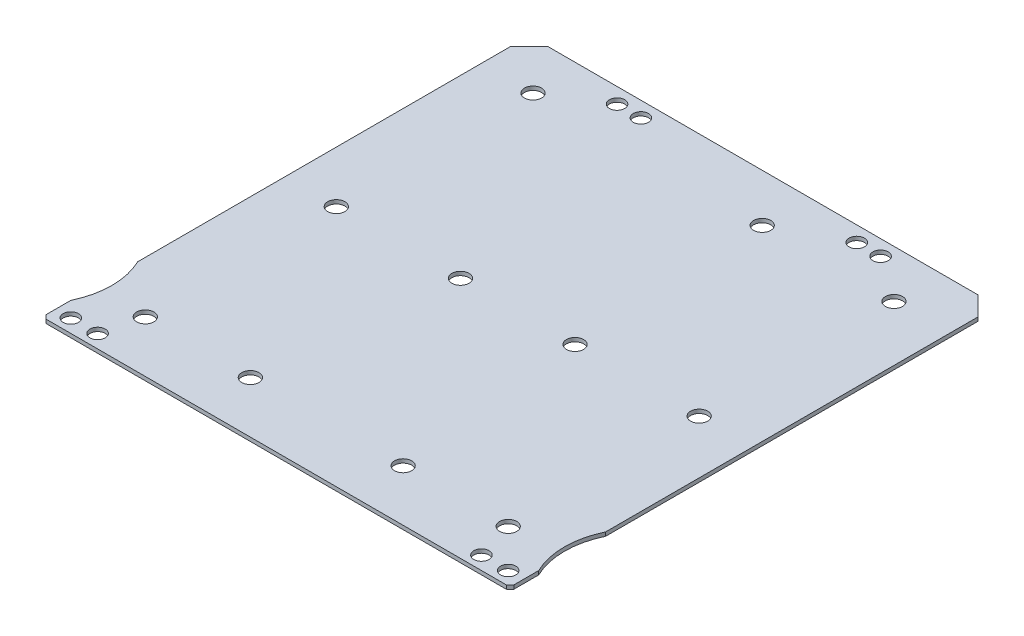
ISO-10303-21;
HEADER;
FILE_DESCRIPTION(('STEP AP214'),'2;1');
FILE_NAME('part.step','',(''),(''),'','','');
FILE_SCHEMA(('AUTOMOTIVE_DESIGN { 1 0 10303 214 1 1 1 1 }'));
ENDSEC;
DATA;
#1=APPLICATION_CONTEXT('core data for automotive mechanical design processes');
#2=APPLICATION_PROTOCOL_DEFINITION('international standard','automotive_design',2000,#1);
#3=PRODUCT_CONTEXT('',#1,'mechanical');
#4=PRODUCT('Part','Part','',(#3));
#5=PRODUCT_RELATED_PRODUCT_CATEGORY('part','',(#4));
#6=PRODUCT_DEFINITION_FORMATION('','',#4);
#7=PRODUCT_DEFINITION_CONTEXT('part definition',#1,'design');
#8=PRODUCT_DEFINITION('design','',#6,#7);
#9=PRODUCT_DEFINITION_SHAPE('','',#8);
#10=(LENGTH_UNIT() NAMED_UNIT(*) SI_UNIT(.MILLI.,.METRE.));
#11=(NAMED_UNIT(*) PLANE_ANGLE_UNIT() SI_UNIT($,.RADIAN.));
#12=(NAMED_UNIT(*) SI_UNIT($,.STERADIAN.) SOLID_ANGLE_UNIT());
#13=UNCERTAINTY_MEASURE_WITH_UNIT(LENGTH_MEASURE(1.E-05),#10,'distance_accuracy_value','');
#14=(GEOMETRIC_REPRESENTATION_CONTEXT(3) GLOBAL_UNCERTAINTY_ASSIGNED_CONTEXT((#13)) GLOBAL_UNIT_ASSIGNED_CONTEXT((#10,
#11,#12)) REPRESENTATION_CONTEXT('',''));
#15=CARTESIAN_POINT('',(0.,0.,0.));
#16=DIRECTION('',(0.,0.,1.));
#17=DIRECTION('',(1.,0.,0.));
#18=AXIS2_PLACEMENT_3D('',#15,#16,#17);
#19=CARTESIAN_POINT('',(-36.2812500000003,2.,-32.5));
#20=DIRECTION('',(0.,-1.,0.));
#21=DIRECTION('',(0.,0.,-1.));
#22=AXIS2_PLACEMENT_3D('',#19,#20,#21);
#23=PLANE('',#22);
#24=DIRECTION('',(0.,0.,-1.));
#25=VECTOR('',#24,1.);
#26=CARTESIAN_POINT('',(245.,2.,-50.));
#27=LINE('',#26,#25);
#28=CARTESIAN_POINT('',(245.,2.,-50.));
#29=VERTEX_POINT('',#28);
#30=CARTESIAN_POINT('',(245.,2.,-245.));
#31=VERTEX_POINT('',#30);
#32=EDGE_CURVE('E149',#29,#31,#27,.T.);
#33=ORIENTED_EDGE('',*,*,#32,.T.);
#34=DIRECTION('',(0.707106781186548,0.,0.707106781186548));
#35=VECTOR('',#34,1.);
#36=CARTESIAN_POINT('',(235.,2.,-255.));
#37=LINE('',#36,#35);
#38=CARTESIAN_POINT('',(235.,2.,-255.));
#39=VERTEX_POINT('',#38);
#40=EDGE_CURVE('E41',#31,#39,#37,.F.);
#41=ORIENTED_EDGE('',*,*,#40,.T.);
#42=DIRECTION('',(-1.,0.,0.));
#43=VECTOR('',#42,1.);
#44=CARTESIAN_POINT('',(0.,2.,-255.));
#45=LINE('',#44,#43);
#46=CARTESIAN_POINT('',(10.,2.,-255.));
#47=VERTEX_POINT('',#46);
#48=EDGE_CURVE('E151',#39,#47,#45,.T.);
#49=ORIENTED_EDGE('',*,*,#48,.T.);
#50=DIRECTION('',(0.707106781186549,0.,-0.707106781186546));
#51=VECTOR('',#50,1.);
#52=CARTESIAN_POINT('',(0.,2.,-245.));
#53=LINE('',#52,#51);
#54=CARTESIAN_POINT('',(0.,2.,-245.));
#55=VERTEX_POINT('',#54);
#56=EDGE_CURVE('E48',#47,#55,#53,.F.);
#57=ORIENTED_EDGE('',*,*,#56,.T.);
#58=DIRECTION('',(0.,0.,1.));
#59=VECTOR('',#58,1.);
#60=CARTESIAN_POINT('',(0.,2.,-50.));
#61=LINE('',#60,#59);
#62=CARTESIAN_POINT('',(0.,2.,-50.));
#63=VERTEX_POINT('',#62);
#64=EDGE_CURVE('E156',#55,#63,#61,.T.);
#65=ORIENTED_EDGE('',*,*,#64,.T.);
#66=CARTESIAN_POINT('',(-36.2812500000003,2.,-32.5));
#67=DIRECTION('',(0.,-1.,0.));
#68=DIRECTION('',(0.,0.,-1.));
#69=AXIS2_PLACEMENT_3D('',#66,#67,#68);
#70=CIRCLE('',#69,40.2812500000003);
#71=CARTESIAN_POINT('',(0.,2.,-15.));
#72=VERTEX_POINT('',#71);
#73=EDGE_CURVE('E158',#63,#72,#70,.T.);
#74=ORIENTED_EDGE('',*,*,#73,.T.);
#75=DIRECTION('',(0.,0.,1.));
#76=VECTOR('',#75,1.);
#77=CARTESIAN_POINT('',(0.,2.,0.));
#78=LINE('',#77,#76);
#79=CARTESIAN_POINT('',(0.,2.,-2.00000000000006));
#80=VERTEX_POINT('',#79);
#81=EDGE_CURVE('E180',#72,#80,#78,.T.);
#82=ORIENTED_EDGE('',*,*,#81,.T.);
#83=DIRECTION('',(-0.707106781186538,0.,-0.707106781186557));
#84=VECTOR('',#83,1.);
#85=CARTESIAN_POINT('',(2.,2.,0.));
#86=LINE('',#85,#84);
#87=CARTESIAN_POINT('',(2.,2.,0.));
#88=VERTEX_POINT('',#87);
#89=EDGE_CURVE('E198',#80,#88,#86,.F.);
#90=ORIENTED_EDGE('',*,*,#89,.T.);
#91=DIRECTION('',(1.,0.,0.));
#92=VECTOR('',#91,1.);
#93=CARTESIAN_POINT('',(0.,2.,0.));
#94=LINE('',#93,#92);
#95=CARTESIAN_POINT('',(243.,2.,0.));
#96=VERTEX_POINT('',#95);
#97=EDGE_CURVE('E135',#88,#96,#94,.T.);
#98=ORIENTED_EDGE('',*,*,#97,.T.);
#99=DIRECTION('',(-0.707106781186557,0.,0.707106781186538));
#100=VECTOR('',#99,1.);
#101=CARTESIAN_POINT('',(245.,2.,-2.));
#102=LINE('',#101,#100);
#103=CARTESIAN_POINT('',(245.,2.,-2.));
#104=VERTEX_POINT('',#103);
#105=EDGE_CURVE('E131',#96,#104,#102,.F.);
#106=ORIENTED_EDGE('',*,*,#105,.T.);
#107=DIRECTION('',(0.,0.,-1.));
#108=VECTOR('',#107,1.);
#109=CARTESIAN_POINT('',(245.,2.,0.));
#110=LINE('',#109,#108);
#111=CARTESIAN_POINT('',(245.,2.,-15.));
#112=VERTEX_POINT('',#111);
#113=EDGE_CURVE('E123',#104,#112,#110,.T.);
#114=ORIENTED_EDGE('',*,*,#113,.T.);
#115=CARTESIAN_POINT('',(281.28125,2.,-32.5));
#116=DIRECTION('',(0.,-1.,0.));
#117=DIRECTION('',(0.,0.,1.));
#118=AXIS2_PLACEMENT_3D('',#115,#116,#117);
#119=CIRCLE('',#118,40.2812500000003);
#120=EDGE_CURVE('E127',#112,#29,#119,.T.);
#121=ORIENTED_EDGE('',*,*,#120,.T.);
#122=EDGE_LOOP('',(#33,#41,#49,#57,#65,#74,#82,#90,#98,#106,#114,#121));
#123=FACE_BOUND('',#122,.T.);
#124=CARTESIAN_POINT('',(8.,2.,-7.));
#125=DIRECTION('',(0.,1.,0.));
#126=DIRECTION('',(0.,0.,1.));
#127=AXIS2_PLACEMENT_3D('',#124,#125,#126);
#128=CIRCLE('',#127,4.);
#129=CARTESIAN_POINT('',(8.,2.,-3.));
#130=VERTEX_POINT('',#129);
#131=EDGE_CURVE('E165',#130,#130,#128,.T.);
#132=ORIENTED_EDGE('',*,*,#131,.F.);
#133=EDGE_LOOP('',(#132));
#134=FACE_BOUND('',#133,.T.);
#135=CARTESIAN_POINT('',(22.,2.,-7.));
#136=DIRECTION('',(0.,1.,0.));
#137=DIRECTION('',(0.,0.,1.));
#138=AXIS2_PLACEMENT_3D('',#135,#136,#137);
#139=CIRCLE('',#138,4.00000000000001);
#140=CARTESIAN_POINT('',(22.,2.,-2.99999999999999));
#141=VERTEX_POINT('',#140);
#142=EDGE_CURVE('E283',#141,#141,#139,.T.);
#143=ORIENTED_EDGE('',*,*,#142,.F.);
#144=EDGE_LOOP('',(#143));
#145=FACE_BOUND('',#144,.T.);
#146=CARTESIAN_POINT('',(237.,2.,-7.));
#147=DIRECTION('',(0.,1.,0.));
#148=DIRECTION('',(0.,0.,1.));
#149=AXIS2_PLACEMENT_3D('',#146,#147,#148);
#150=CIRCLE('',#149,3.99999999999999);
#151=CARTESIAN_POINT('',(237.,2.,-3.00000000000001));
#152=VERTEX_POINT('',#151);
#153=EDGE_CURVE('E289',#152,#152,#150,.T.);
#154=ORIENTED_EDGE('',*,*,#153,.F.);
#155=EDGE_LOOP('',(#154));
#156=FACE_BOUND('',#155,.T.);
#157=CARTESIAN_POINT('',(223.,2.,-7.));
#158=DIRECTION('',(0.,1.,0.));
#159=DIRECTION('',(0.,0.,1.));
#160=AXIS2_PLACEMENT_3D('',#157,#158,#159);
#161=CIRCLE('',#160,3.99999999999999);
#162=CARTESIAN_POINT('',(223.,2.,-3.00000000000001));
#163=VERTEX_POINT('',#162);
#164=EDGE_CURVE('E295',#163,#163,#161,.T.);
#165=ORIENTED_EDGE('',*,*,#164,.F.);
#166=EDGE_LOOP('',(#165));
#167=FACE_BOUND('',#166,.T.);
#168=CARTESIAN_POINT('',(27.,2.,-27.));
#169=DIRECTION('',(0.,1.,0.));
#170=DIRECTION('',(0.,0.,1.));
#171=AXIS2_PLACEMENT_3D('',#168,#169,#170);
#172=CIRCLE('',#171,4.5);
#173=CARTESIAN_POINT('',(27.,2.,-22.5));
#174=VERTEX_POINT('',#173);
#175=EDGE_CURVE('E301',#174,#174,#172,.T.);
#176=ORIENTED_EDGE('',*,*,#175,.F.);
#177=EDGE_LOOP('',(#176));
#178=FACE_BOUND('',#177,.T.);
#179=CARTESIAN_POINT('',(82.,2.,-27.));
#180=DIRECTION('',(0.,1.,0.));
#181=DIRECTION('',(0.,0.,1.));
#182=AXIS2_PLACEMENT_3D('',#179,#180,#181);
#183=CIRCLE('',#182,4.5);
#184=CARTESIAN_POINT('',(82.,2.,-22.5));
#185=VERTEX_POINT('',#184);
#186=EDGE_CURVE('E307',#185,#185,#183,.T.);
#187=ORIENTED_EDGE('',*,*,#186,.F.);
#188=EDGE_LOOP('',(#187));
#189=FACE_BOUND('',#188,.T.);
#190=CARTESIAN_POINT('',(162.,2.,-27.));
#191=DIRECTION('',(0.,1.,0.));
#192=DIRECTION('',(0.,0.,1.));
#193=AXIS2_PLACEMENT_3D('',#190,#191,#192);
#194=CIRCLE('',#193,4.49999999999999);
#195=CARTESIAN_POINT('',(162.,2.,-22.5));
#196=VERTEX_POINT('',#195);
#197=EDGE_CURVE('E313',#196,#196,#194,.T.);
#198=ORIENTED_EDGE('',*,*,#197,.F.);
#199=EDGE_LOOP('',(#198));
#200=FACE_BOUND('',#199,.T.);
#201=CARTESIAN_POINT('',(217.,2.,-27.));
#202=DIRECTION('',(0.,1.,0.));
#203=DIRECTION('',(0.,0.,1.));
#204=AXIS2_PLACEMENT_3D('',#201,#202,#203);
#205=CIRCLE('',#204,4.49999999999999);
#206=CARTESIAN_POINT('',(217.,2.,-22.5));
#207=VERTEX_POINT('',#206);
#208=EDGE_CURVE('E319',#207,#207,#205,.T.);
#209=ORIENTED_EDGE('',*,*,#208,.F.);
#210=EDGE_LOOP('',(#209));
#211=FACE_BOUND('',#210,.T.);
#212=CARTESIAN_POINT('',(27.,2.,-127.));
#213=DIRECTION('',(0.,1.,0.));
#214=DIRECTION('',(0.,0.,1.));
#215=AXIS2_PLACEMENT_3D('',#212,#213,#214);
#216=CIRCLE('',#215,4.5);
#217=CARTESIAN_POINT('',(27.,2.,-122.5));
#218=VERTEX_POINT('',#217);
#219=EDGE_CURVE('E325',#218,#218,#216,.T.);
#220=ORIENTED_EDGE('',*,*,#219,.F.);
#221=EDGE_LOOP('',(#220));
#222=FACE_BOUND('',#221,.T.);
#223=CARTESIAN_POINT('',(92.,2.,-127.));
#224=DIRECTION('',(0.,1.,0.));
#225=DIRECTION('',(0.,0.,1.));
#226=AXIS2_PLACEMENT_3D('',#223,#224,#225);
#227=CIRCLE('',#226,4.50000000000001);
#228=CARTESIAN_POINT('',(92.,2.,-122.5));
#229=VERTEX_POINT('',#228);
#230=EDGE_CURVE('E331',#229,#229,#227,.T.);
#231=ORIENTED_EDGE('',*,*,#230,.F.);
#232=EDGE_LOOP('',(#231));
#233=FACE_BOUND('',#232,.T.);
#234=CARTESIAN_POINT('',(152.,2.,-127.));
#235=DIRECTION('',(0.,1.,0.));
#236=DIRECTION('',(0.,0.,1.));
#237=AXIS2_PLACEMENT_3D('',#234,#235,#236);
#238=CIRCLE('',#237,4.49999999999999);
#239=CARTESIAN_POINT('',(152.,2.,-122.5));
#240=VERTEX_POINT('',#239);
#241=EDGE_CURVE('E337',#240,#240,#238,.T.);
#242=ORIENTED_EDGE('',*,*,#241,.F.);
#243=EDGE_LOOP('',(#242));
#244=FACE_BOUND('',#243,.T.);
#245=CARTESIAN_POINT('',(217.,2.,-127.));
#246=DIRECTION('',(0.,1.,0.));
#247=DIRECTION('',(0.,0.,1.));
#248=AXIS2_PLACEMENT_3D('',#245,#246,#247);
#249=CIRCLE('',#248,4.50000000000002);
#250=CARTESIAN_POINT('',(217.,2.,-122.5));
#251=VERTEX_POINT('',#250);
#252=EDGE_CURVE('E343',#251,#251,#249,.T.);
#253=ORIENTED_EDGE('',*,*,#252,.F.);
#254=EDGE_LOOP('',(#253));
#255=FACE_BOUND('',#254,.T.);
#256=CARTESIAN_POINT('',(27.,2.,-230.));
#257=DIRECTION('',(0.,1.,0.));
#258=DIRECTION('',(0.,0.,1.));
#259=AXIS2_PLACEMENT_3D('',#256,#257,#258);
#260=CIRCLE('',#259,4.5);
#261=CARTESIAN_POINT('',(27.,2.,-225.5));
#262=VERTEX_POINT('',#261);
#263=EDGE_CURVE('E349',#262,#262,#260,.T.);
#264=ORIENTED_EDGE('',*,*,#263,.F.);
#265=EDGE_LOOP('',(#264));
#266=FACE_BOUND('',#265,.T.);
#267=CARTESIAN_POINT('',(147.,2.,-230.));
#268=DIRECTION('',(0.,1.,0.));
#269=DIRECTION('',(0.,0.,1.));
#270=AXIS2_PLACEMENT_3D('',#267,#268,#269);
#271=CIRCLE('',#270,4.49999999999999);
#272=CARTESIAN_POINT('',(147.,2.,-225.5));
#273=VERTEX_POINT('',#272);
#274=EDGE_CURVE('E355',#273,#273,#271,.T.);
#275=ORIENTED_EDGE('',*,*,#274,.F.);
#276=EDGE_LOOP('',(#275));
#277=FACE_BOUND('',#276,.T.);
#278=CARTESIAN_POINT('',(216.,2.,-230.));
#279=DIRECTION('',(0.,1.,0.));
#280=DIRECTION('',(0.,0.,1.));
#281=AXIS2_PLACEMENT_3D('',#278,#279,#280);
#282=CIRCLE('',#281,4.49999999999999);
#283=CARTESIAN_POINT('',(216.,2.,-225.5));
#284=VERTEX_POINT('',#283);
#285=EDGE_CURVE('E361',#284,#284,#282,.T.);
#286=ORIENTED_EDGE('',*,*,#285,.F.);
#287=EDGE_LOOP('',(#286));
#288=FACE_BOUND('',#287,.T.);
#289=CARTESIAN_POINT('',(54.,2.,-247.));
#290=DIRECTION('',(0.,1.,0.));
#291=DIRECTION('',(0.,0.,1.));
#292=AXIS2_PLACEMENT_3D('',#289,#290,#291);
#293=CIRCLE('',#292,4.);
#294=CARTESIAN_POINT('',(54.,2.,-243.));
#295=VERTEX_POINT('',#294);
#296=EDGE_CURVE('E367',#295,#295,#293,.T.);
#297=ORIENTED_EDGE('',*,*,#296,.F.);
#298=EDGE_LOOP('',(#297));
#299=FACE_BOUND('',#298,.T.);
#300=CARTESIAN_POINT('',(66.5,2.,-247.));
#301=DIRECTION('',(0.,1.,0.));
#302=DIRECTION('',(0.,0.,1.));
#303=AXIS2_PLACEMENT_3D('',#300,#301,#302);
#304=CIRCLE('',#303,4.00000000000001);
#305=CARTESIAN_POINT('',(66.5,2.,-243.));
#306=VERTEX_POINT('',#305);
#307=EDGE_CURVE('E373',#306,#306,#304,.T.);
#308=ORIENTED_EDGE('',*,*,#307,.F.);
#309=EDGE_LOOP('',(#308));
#310=FACE_BOUND('',#309,.T.);
#311=CARTESIAN_POINT('',(179.5,2.,-247.));
#312=DIRECTION('',(0.,1.,0.));
#313=DIRECTION('',(0.,0.,1.));
#314=AXIS2_PLACEMENT_3D('',#311,#312,#313);
#315=CIRCLE('',#314,3.99999999999999);
#316=CARTESIAN_POINT('',(179.5,2.,-243.));
#317=VERTEX_POINT('',#316);
#318=EDGE_CURVE('E379',#317,#317,#315,.T.);
#319=ORIENTED_EDGE('',*,*,#318,.F.);
#320=EDGE_LOOP('',(#319));
#321=FACE_BOUND('',#320,.T.);
#322=CARTESIAN_POINT('',(192.,2.,-247.));
#323=DIRECTION('',(0.,1.,0.));
#324=DIRECTION('',(0.,0.,1.));
#325=AXIS2_PLACEMENT_3D('',#322,#323,#324);
#326=CIRCLE('',#325,3.99999999999999);
#327=CARTESIAN_POINT('',(192.,2.,-243.));
#328=VERTEX_POINT('',#327);
#329=EDGE_CURVE('E385',#328,#328,#326,.T.);
#330=ORIENTED_EDGE('',*,*,#329,.F.);
#331=EDGE_LOOP('',(#330));
#332=FACE_BOUND('',#331,.T.);
#333=ADVANCED_FACE('F33',(#123,#134,#145,#156,#167,#178,#189,#200,#211,#222,#233,#244,#255,#266,
#277,#288,#299,#310,#321,#332),#23,.F.);
#334=CARTESIAN_POINT('',(-36.2812500000003,0.,-32.5));
#335=DIRECTION('',(0.,-1.,0.));
#336=DIRECTION('',(0.,0.,-1.));
#337=AXIS2_PLACEMENT_3D('',#334,#335,#336);
#338=PLANE('',#337);
#339=CARTESIAN_POINT('',(179.5,0.,-247.));
#340=DIRECTION('',(0.,1.,0.));
#341=DIRECTION('',(0.,0.,1.));
#342=AXIS2_PLACEMENT_3D('',#339,#340,#341);
#343=CIRCLE('',#342,3.99999999999999);
#344=CARTESIAN_POINT('',(179.5,0.,-243.));
#345=VERTEX_POINT('',#344);
#346=EDGE_CURVE('E382',#345,#345,#343,.T.);
#347=ORIENTED_EDGE('',*,*,#346,.T.);
#348=EDGE_LOOP('',(#347));
#349=FACE_BOUND('',#348,.T.);
#350=CARTESIAN_POINT('',(54.,0.,-247.));
#351=DIRECTION('',(0.,1.,0.));
#352=DIRECTION('',(0.,0.,1.));
#353=AXIS2_PLACEMENT_3D('',#350,#351,#352);
#354=CIRCLE('',#353,4.);
#355=CARTESIAN_POINT('',(54.,0.,-243.));
#356=VERTEX_POINT('',#355);
#357=EDGE_CURVE('E370',#356,#356,#354,.T.);
#358=ORIENTED_EDGE('',*,*,#357,.T.);
#359=EDGE_LOOP('',(#358));
#360=FACE_BOUND('',#359,.T.);
#361=CARTESIAN_POINT('',(147.,0.,-230.));
#362=DIRECTION('',(0.,1.,0.));
#363=DIRECTION('',(0.,0.,1.));
#364=AXIS2_PLACEMENT_3D('',#361,#362,#363);
#365=CIRCLE('',#364,4.49999999999999);
#366=CARTESIAN_POINT('',(147.,0.,-225.5));
#367=VERTEX_POINT('',#366);
#368=EDGE_CURVE('E358',#367,#367,#365,.T.);
#369=ORIENTED_EDGE('',*,*,#368,.T.);
#370=EDGE_LOOP('',(#369));
#371=FACE_BOUND('',#370,.T.);
#372=CARTESIAN_POINT('',(217.,0.,-127.));
#373=DIRECTION('',(0.,1.,0.));
#374=DIRECTION('',(0.,0.,1.));
#375=AXIS2_PLACEMENT_3D('',#372,#373,#374);
#376=CIRCLE('',#375,4.50000000000002);
#377=CARTESIAN_POINT('',(217.,0.,-122.5));
#378=VERTEX_POINT('',#377);
#379=EDGE_CURVE('E346',#378,#378,#376,.T.);
#380=ORIENTED_EDGE('',*,*,#379,.T.);
#381=EDGE_LOOP('',(#380));
#382=FACE_BOUND('',#381,.T.);
#383=CARTESIAN_POINT('',(92.,0.,-127.));
#384=DIRECTION('',(0.,1.,0.));
#385=DIRECTION('',(0.,0.,1.));
#386=AXIS2_PLACEMENT_3D('',#383,#384,#385);
#387=CIRCLE('',#386,4.50000000000001);
#388=CARTESIAN_POINT('',(92.,0.,-122.5));
#389=VERTEX_POINT('',#388);
#390=EDGE_CURVE('E334',#389,#389,#387,.T.);
#391=ORIENTED_EDGE('',*,*,#390,.T.);
#392=EDGE_LOOP('',(#391));
#393=FACE_BOUND('',#392,.T.);
#394=CARTESIAN_POINT('',(217.,0.,-27.));
#395=DIRECTION('',(0.,1.,0.));
#396=DIRECTION('',(0.,0.,1.));
#397=AXIS2_PLACEMENT_3D('',#394,#395,#396);
#398=CIRCLE('',#397,4.49999999999999);
#399=CARTESIAN_POINT('',(217.,0.,-22.5));
#400=VERTEX_POINT('',#399);
#401=EDGE_CURVE('E322',#400,#400,#398,.T.);
#402=ORIENTED_EDGE('',*,*,#401,.T.);
#403=EDGE_LOOP('',(#402));
#404=FACE_BOUND('',#403,.T.);
#405=CARTESIAN_POINT('',(82.,0.,-27.));
#406=DIRECTION('',(0.,1.,0.));
#407=DIRECTION('',(0.,0.,1.));
#408=AXIS2_PLACEMENT_3D('',#405,#406,#407);
#409=CIRCLE('',#408,4.5);
#410=CARTESIAN_POINT('',(82.,0.,-22.5));
#411=VERTEX_POINT('',#410);
#412=EDGE_CURVE('E310',#411,#411,#409,.T.);
#413=ORIENTED_EDGE('',*,*,#412,.T.);
#414=EDGE_LOOP('',(#413));
#415=FACE_BOUND('',#414,.T.);
#416=CARTESIAN_POINT('',(223.,0.,-7.));
#417=DIRECTION('',(0.,1.,0.));
#418=DIRECTION('',(0.,0.,1.));
#419=AXIS2_PLACEMENT_3D('',#416,#417,#418);
#420=CIRCLE('',#419,3.99999999999999);
#421=CARTESIAN_POINT('',(223.,0.,-3.00000000000001));
#422=VERTEX_POINT('',#421);
#423=EDGE_CURVE('E298',#422,#422,#420,.T.);
#424=ORIENTED_EDGE('',*,*,#423,.T.);
#425=EDGE_LOOP('',(#424));
#426=FACE_BOUND('',#425,.T.);
#427=CARTESIAN_POINT('',(22.,0.,-7.));
#428=DIRECTION('',(0.,1.,0.));
#429=DIRECTION('',(0.,0.,1.));
#430=AXIS2_PLACEMENT_3D('',#427,#428,#429);
#431=CIRCLE('',#430,4.00000000000001);
#432=CARTESIAN_POINT('',(22.,0.,-2.99999999999999));
#433=VERTEX_POINT('',#432);
#434=EDGE_CURVE('E286',#433,#433,#431,.T.);
#435=ORIENTED_EDGE('',*,*,#434,.T.);
#436=EDGE_LOOP('',(#435));
#437=FACE_BOUND('',#436,.T.);
#438=DIRECTION('',(-1.,0.,0.));
#439=VECTOR('',#438,1.);
#440=CARTESIAN_POINT('',(0.,0.,-255.));
#441=LINE('',#440,#439);
#442=CARTESIAN_POINT('',(235.,0.,-255.));
#443=VERTEX_POINT('',#442);
#444=CARTESIAN_POINT('',(10.,0.,-255.));
#445=VERTEX_POINT('',#444);
#446=EDGE_CURVE('E173',#443,#445,#441,.T.);
#447=ORIENTED_EDGE('',*,*,#446,.F.);
#448=DIRECTION('',(-0.707106781186548,0.,-0.707106781186548));
#449=VECTOR('',#448,1.);
#450=CARTESIAN_POINT('',(210.609375,0.,-279.390625));
#451=LINE('',#450,#449);
#452=CARTESIAN_POINT('',(245.,0.,-245.));
#453=VERTEX_POINT('',#452);
#454=EDGE_CURVE('E209',#443,#453,#451,.F.);
#455=ORIENTED_EDGE('',*,*,#454,.T.);
#456=DIRECTION('',(0.,0.,-1.));
#457=VECTOR('',#456,1.);
#458=CARTESIAN_POINT('',(245.,0.,-50.));
#459=LINE('',#458,#457);
#460=CARTESIAN_POINT('',(245.,0.,-50.));
#461=VERTEX_POINT('',#460);
#462=EDGE_CURVE('E171',#461,#453,#459,.T.);
#463=ORIENTED_EDGE('',*,*,#462,.F.);
#464=CARTESIAN_POINT('',(281.28125,0.,-32.5));
#465=DIRECTION('',(0.,-1.,0.));
#466=DIRECTION('',(0.,0.,1.));
#467=AXIS2_PLACEMENT_3D('',#464,#465,#466);
#468=CIRCLE('',#467,40.2812500000003);
#469=CARTESIAN_POINT('',(245.,0.,-15.));
#470=VERTEX_POINT('',#469);
#471=EDGE_CURVE('E169',#470,#461,#468,.T.);
#472=ORIENTED_EDGE('',*,*,#471,.F.);
#473=DIRECTION('',(0.,0.,-1.));
#474=VECTOR('',#473,1.);
#475=CARTESIAN_POINT('',(245.,0.,0.));
#476=LINE('',#475,#474);
#477=CARTESIAN_POINT('',(245.,0.,-2.));
#478=VERTEX_POINT('',#477);
#479=EDGE_CURVE('E141',#478,#470,#476,.T.);
#480=ORIENTED_EDGE('',*,*,#479,.F.);
#481=DIRECTION('',(0.707106781186557,0.,-0.707106781186538));
#482=VECTOR('',#481,1.);
#483=CARTESIAN_POINT('',(119.609374999996,0.,123.390625000001));
#484=LINE('',#483,#482);
#485=CARTESIAN_POINT('',(243.,0.,0.));
#486=VERTEX_POINT('',#485);
#487=EDGE_CURVE('E191',#478,#486,#484,.F.);
#488=ORIENTED_EDGE('',*,*,#487,.T.);
#489=DIRECTION('',(1.,0.,0.));
#490=VECTOR('',#489,1.);
#491=CARTESIAN_POINT('',(0.,0.,0.));
#492=LINE('',#491,#490);
#493=CARTESIAN_POINT('',(2.,0.,0.));
#494=VERTEX_POINT('',#493);
#495=EDGE_CURVE('E164',#494,#486,#492,.T.);
#496=ORIENTED_EDGE('',*,*,#495,.F.);
#497=DIRECTION('',(0.707106781186538,0.,0.707106781186557));
#498=VECTOR('',#497,1.);
#499=CARTESIAN_POINT('',(-33.3906249999996,0.,-35.3906250000006));
#500=LINE('',#499,#498);
#501=CARTESIAN_POINT('',(0.,0.,-2.00000000000006));
#502=VERTEX_POINT('',#501);
#503=EDGE_CURVE('E193',#494,#502,#500,.F.);
#504=ORIENTED_EDGE('',*,*,#503,.T.);
#505=DIRECTION('',(0.,0.,1.));
#506=VECTOR('',#505,1.);
#507=CARTESIAN_POINT('',(0.,0.,0.));
#508=LINE('',#507,#506);
#509=CARTESIAN_POINT('',(0.,0.,-15.));
#510=VERTEX_POINT('',#509);
#511=EDGE_CURVE('E161',#510,#502,#508,.T.);
#512=ORIENTED_EDGE('',*,*,#511,.F.);
#513=CARTESIAN_POINT('',(-36.2812500000003,0.,-32.5));
#514=DIRECTION('',(0.,-1.,0.));
#515=DIRECTION('',(0.,0.,-1.));
#516=AXIS2_PLACEMENT_3D('',#513,#514,#515);
#517=CIRCLE('',#516,40.2812500000003);
#518=CARTESIAN_POINT('',(0.,0.,-50.));
#519=VERTEX_POINT('',#518);
#520=EDGE_CURVE('E178',#519,#510,#517,.T.);
#521=ORIENTED_EDGE('',*,*,#520,.F.);
#522=DIRECTION('',(0.,0.,1.));
#523=VECTOR('',#522,1.);
#524=CARTESIAN_POINT('',(0.,0.,-50.));
#525=LINE('',#524,#523);
#526=CARTESIAN_POINT('',(0.,0.,-245.));
#527=VERTEX_POINT('',#526);
#528=EDGE_CURVE('E176',#527,#519,#525,.T.);
#529=ORIENTED_EDGE('',*,*,#528,.F.);
#530=DIRECTION('',(-0.707106781186549,0.,0.707106781186546));
#531=VECTOR('',#530,1.);
#532=CARTESIAN_POINT('',(-124.390625,0.,-120.609375));
#533=LINE('',#532,#531);
#534=EDGE_CURVE('E207',#527,#445,#533,.F.);
#535=ORIENTED_EDGE('',*,*,#534,.T.);
#536=EDGE_LOOP('',(#447,#455,#463,#472,#480,#488,#496,#504,#512,#521,#529,#535));
#537=FACE_BOUND('',#536,.T.);
#538=CARTESIAN_POINT('',(8.,0.,-7.));
#539=DIRECTION('',(0.,1.,0.));
#540=DIRECTION('',(0.,0.,1.));
#541=AXIS2_PLACEMENT_3D('',#538,#539,#540);
#542=CIRCLE('',#541,4.);
#543=CARTESIAN_POINT('',(8.,0.,-3.));
#544=VERTEX_POINT('',#543);
#545=EDGE_CURVE('E280',#544,#544,#542,.T.);
#546=ORIENTED_EDGE('',*,*,#545,.T.);
#547=EDGE_LOOP('',(#546));
#548=FACE_BOUND('',#547,.T.);
#549=CARTESIAN_POINT('',(237.,0.,-7.));
#550=DIRECTION('',(0.,1.,0.));
#551=DIRECTION('',(0.,0.,1.));
#552=AXIS2_PLACEMENT_3D('',#549,#550,#551);
#553=CIRCLE('',#552,3.99999999999999);
#554=CARTESIAN_POINT('',(237.,0.,-3.00000000000001));
#555=VERTEX_POINT('',#554);
#556=EDGE_CURVE('E292',#555,#555,#553,.T.);
#557=ORIENTED_EDGE('',*,*,#556,.T.);
#558=EDGE_LOOP('',(#557));
#559=FACE_BOUND('',#558,.T.);
#560=CARTESIAN_POINT('',(27.,0.,-27.));
#561=DIRECTION('',(0.,1.,0.));
#562=DIRECTION('',(0.,0.,1.));
#563=AXIS2_PLACEMENT_3D('',#560,#561,#562);
#564=CIRCLE('',#563,4.5);
#565=CARTESIAN_POINT('',(27.,0.,-22.5));
#566=VERTEX_POINT('',#565);
#567=EDGE_CURVE('E304',#566,#566,#564,.T.);
#568=ORIENTED_EDGE('',*,*,#567,.T.);
#569=EDGE_LOOP('',(#568));
#570=FACE_BOUND('',#569,.T.);
#571=CARTESIAN_POINT('',(162.,0.,-27.));
#572=DIRECTION('',(0.,1.,0.));
#573=DIRECTION('',(0.,0.,1.));
#574=AXIS2_PLACEMENT_3D('',#571,#572,#573);
#575=CIRCLE('',#574,4.49999999999999);
#576=CARTESIAN_POINT('',(162.,0.,-22.5));
#577=VERTEX_POINT('',#576);
#578=EDGE_CURVE('E316',#577,#577,#575,.T.);
#579=ORIENTED_EDGE('',*,*,#578,.T.);
#580=EDGE_LOOP('',(#579));
#581=FACE_BOUND('',#580,.T.);
#582=CARTESIAN_POINT('',(27.,0.,-127.));
#583=DIRECTION('',(0.,1.,0.));
#584=DIRECTION('',(0.,0.,1.));
#585=AXIS2_PLACEMENT_3D('',#582,#583,#584);
#586=CIRCLE('',#585,4.5);
#587=CARTESIAN_POINT('',(27.,0.,-122.5));
#588=VERTEX_POINT('',#587);
#589=EDGE_CURVE('E328',#588,#588,#586,.T.);
#590=ORIENTED_EDGE('',*,*,#589,.T.);
#591=EDGE_LOOP('',(#590));
#592=FACE_BOUND('',#591,.T.);
#593=CARTESIAN_POINT('',(152.,0.,-127.));
#594=DIRECTION('',(0.,1.,0.));
#595=DIRECTION('',(0.,0.,1.));
#596=AXIS2_PLACEMENT_3D('',#593,#594,#595);
#597=CIRCLE('',#596,4.49999999999999);
#598=CARTESIAN_POINT('',(152.,0.,-122.5));
#599=VERTEX_POINT('',#598);
#600=EDGE_CURVE('E340',#599,#599,#597,.T.);
#601=ORIENTED_EDGE('',*,*,#600,.T.);
#602=EDGE_LOOP('',(#601));
#603=FACE_BOUND('',#602,.T.);
#604=CARTESIAN_POINT('',(27.,0.,-230.));
#605=DIRECTION('',(0.,1.,0.));
#606=DIRECTION('',(0.,0.,1.));
#607=AXIS2_PLACEMENT_3D('',#604,#605,#606);
#608=CIRCLE('',#607,4.5);
#609=CARTESIAN_POINT('',(27.,0.,-225.5));
#610=VERTEX_POINT('',#609);
#611=EDGE_CURVE('E352',#610,#610,#608,.T.);
#612=ORIENTED_EDGE('',*,*,#611,.T.);
#613=EDGE_LOOP('',(#612));
#614=FACE_BOUND('',#613,.T.);
#615=CARTESIAN_POINT('',(216.,0.,-230.));
#616=DIRECTION('',(0.,1.,0.));
#617=DIRECTION('',(0.,0.,1.));
#618=AXIS2_PLACEMENT_3D('',#615,#616,#617);
#619=CIRCLE('',#618,4.49999999999999);
#620=CARTESIAN_POINT('',(216.,0.,-225.5));
#621=VERTEX_POINT('',#620);
#622=EDGE_CURVE('E364',#621,#621,#619,.T.);
#623=ORIENTED_EDGE('',*,*,#622,.T.);
#624=EDGE_LOOP('',(#623));
#625=FACE_BOUND('',#624,.T.);
#626=CARTESIAN_POINT('',(66.5,0.,-247.));
#627=DIRECTION('',(0.,1.,0.));
#628=DIRECTION('',(0.,0.,1.));
#629=AXIS2_PLACEMENT_3D('',#626,#627,#628);
#630=CIRCLE('',#629,4.00000000000001);
#631=CARTESIAN_POINT('',(66.5,0.,-243.));
#632=VERTEX_POINT('',#631);
#633=EDGE_CURVE('E376',#632,#632,#630,.T.);
#634=ORIENTED_EDGE('',*,*,#633,.T.);
#635=EDGE_LOOP('',(#634));
#636=FACE_BOUND('',#635,.T.);
#637=CARTESIAN_POINT('',(192.,0.,-247.));
#638=DIRECTION('',(0.,1.,0.));
#639=DIRECTION('',(0.,0.,1.));
#640=AXIS2_PLACEMENT_3D('',#637,#638,#639);
#641=CIRCLE('',#640,3.99999999999999);
#642=CARTESIAN_POINT('',(192.,0.,-243.));
#643=VERTEX_POINT('',#642);
#644=EDGE_CURVE('E388',#643,#643,#641,.T.);
#645=ORIENTED_EDGE('',*,*,#644,.T.);
#646=EDGE_LOOP('',(#645));
#647=FACE_BOUND('',#646,.T.);
#648=ADVANCED_FACE('F223',(#349,#360,#371,#382,#393,#404,#415,#426,#437,#537,#548,#559,#570,
#581,#592,#603,#614,#625,#636,#647),#338,.T.);
#649=CARTESIAN_POINT('',(0.,2.,0.));
#650=DIRECTION('',(1.,0.,0.));
#651=DIRECTION('',(0.,0.,-1.));
#652=AXIS2_PLACEMENT_3D('',#649,#650,#651);
#653=PLANE('',#652);
#654=ORIENTED_EDGE('',*,*,#511,.T.);
#655=DIRECTION('',(0.,1.,0.));
#656=VECTOR('',#655,1.);
#657=CARTESIAN_POINT('',(0.,2.,-2.00000000000006));
#658=LINE('',#657,#656);
#659=EDGE_CURVE('E195',#502,#80,#658,.T.);
#660=ORIENTED_EDGE('',*,*,#659,.T.);
#661=ORIENTED_EDGE('',*,*,#81,.F.);
#662=DIRECTION('',(0.,-1.,0.));
#663=VECTOR('',#662,1.);
#664=CARTESIAN_POINT('',(0.,2.,-15.));
#665=LINE('',#664,#663);
#666=EDGE_CURVE('E160',#72,#510,#665,.T.);
#667=ORIENTED_EDGE('',*,*,#666,.T.);
#668=EDGE_LOOP('',(#654,#660,#661,#667));
#669=FACE_BOUND('',#668,.T.);
#670=ADVANCED_FACE('F240',(#669),#653,.F.);
#671=CARTESIAN_POINT('',(0.,2.,0.));
#672=DIRECTION('',(0.,0.,-1.));
#673=DIRECTION('',(-1.,0.,0.));
#674=AXIS2_PLACEMENT_3D('',#671,#672,#673);
#675=PLANE('',#674);
#676=ORIENTED_EDGE('',*,*,#97,.F.);
#677=DIRECTION('',(0.,-1.,0.));
#678=VECTOR('',#677,1.);
#679=CARTESIAN_POINT('',(2.,2.,0.));
#680=LINE('',#679,#678);
#681=EDGE_CURVE('E188',#88,#494,#680,.T.);
#682=ORIENTED_EDGE('',*,*,#681,.T.);
#683=ORIENTED_EDGE('',*,*,#495,.T.);
#684=DIRECTION('',(0.,1.,0.));
#685=VECTOR('',#684,1.);
#686=CARTESIAN_POINT('',(243.,2.,0.));
#687=LINE('',#686,#685);
#688=EDGE_CURVE('E144',#486,#96,#687,.T.);
#689=ORIENTED_EDGE('',*,*,#688,.T.);
#690=EDGE_LOOP('',(#676,#682,#683,#689));
#691=FACE_BOUND('',#690,.T.);
#692=ADVANCED_FACE('F275',(#691),#675,.F.);
#693=CARTESIAN_POINT('',(245.,2.,0.));
#694=DIRECTION('',(-1.,0.,0.));
#695=DIRECTION('',(0.,0.,1.));
#696=AXIS2_PLACEMENT_3D('',#693,#694,#695);
#697=PLANE('',#696);
#698=ORIENTED_EDGE('',*,*,#113,.F.);
#699=DIRECTION('',(0.,-1.,0.));
#700=VECTOR('',#699,1.);
#701=CARTESIAN_POINT('',(245.,2.,-2.));
#702=LINE('',#701,#700);
#703=EDGE_CURVE('E200',#104,#478,#702,.T.);
#704=ORIENTED_EDGE('',*,*,#703,.T.);
#705=ORIENTED_EDGE('',*,*,#479,.T.);
#706=DIRECTION('',(0.,-1.,0.));
#707=VECTOR('',#706,1.);
#708=CARTESIAN_POINT('',(245.,2.,-15.));
#709=LINE('',#708,#707);
#710=EDGE_CURVE('E138',#112,#470,#709,.T.);
#711=ORIENTED_EDGE('',*,*,#710,.F.);
#712=EDGE_LOOP('',(#698,#704,#705,#711));
#713=FACE_BOUND('',#712,.T.);
#714=ADVANCED_FACE('F139',(#713),#697,.F.);
#715=CARTESIAN_POINT('',(281.28125,2.,-32.5));
#716=DIRECTION('',(0.,-1.,0.));
#717=DIRECTION('',(0.,0.,-1.));
#718=AXIS2_PLACEMENT_3D('',#715,#716,#717);
#719=CYLINDRICAL_SURFACE('',#718,40.2812500000003);
#720=ORIENTED_EDGE('',*,*,#471,.T.);
#721=DIRECTION('',(0.,-1.,0.));
#722=VECTOR('',#721,1.);
#723=CARTESIAN_POINT('',(245.,2.,-50.));
#724=LINE('',#723,#722);
#725=EDGE_CURVE('E145',#29,#461,#724,.T.);
#726=ORIENTED_EDGE('',*,*,#725,.F.);
#727=ORIENTED_EDGE('',*,*,#120,.F.);
#728=ORIENTED_EDGE('',*,*,#710,.T.);
#729=EDGE_LOOP('',(#720,#726,#727,#728));
#730=FACE_BOUND('',#729,.T.);
#731=ADVANCED_FACE('F147',(#730),#719,.F.);
#732=CARTESIAN_POINT('',(245.,2.,-50.));
#733=DIRECTION('',(-1.,0.,0.));
#734=DIRECTION('',(0.,0.,1.));
#735=AXIS2_PLACEMENT_3D('',#732,#733,#734);
#736=PLANE('',#735);
#737=ORIENTED_EDGE('',*,*,#462,.T.);
#738=DIRECTION('',(0.,1.,0.));
#739=VECTOR('',#738,1.);
#740=CARTESIAN_POINT('',(245.,2.,-245.));
#741=LINE('',#740,#739);
#742=EDGE_CURVE('E56',#453,#31,#741,.T.);
#743=ORIENTED_EDGE('',*,*,#742,.T.);
#744=ORIENTED_EDGE('',*,*,#32,.F.);
#745=ORIENTED_EDGE('',*,*,#725,.T.);
#746=EDGE_LOOP('',(#737,#743,#744,#745));
#747=FACE_BOUND('',#746,.T.);
#748=ADVANCED_FACE('F225',(#747),#736,.F.);
#749=CARTESIAN_POINT('',(0.,2.,-255.));
#750=DIRECTION('',(0.,0.,1.));
#751=DIRECTION('',(1.,0.,0.));
#752=AXIS2_PLACEMENT_3D('',#749,#750,#751);
#753=PLANE('',#752);
#754=ORIENTED_EDGE('',*,*,#48,.F.);
#755=DIRECTION('',(0.,-1.,0.));
#756=VECTOR('',#755,1.);
#757=CARTESIAN_POINT('',(235.,2.,-255.));
#758=LINE('',#757,#756);
#759=EDGE_CURVE('E204',#39,#443,#758,.T.);
#760=ORIENTED_EDGE('',*,*,#759,.T.);
#761=ORIENTED_EDGE('',*,*,#446,.T.);
#762=DIRECTION('',(0.,1.,0.));
#763=VECTOR('',#762,1.);
#764=CARTESIAN_POINT('',(10.,2.,-255.));
#765=LINE('',#764,#763);
#766=EDGE_CURVE('E202',#445,#47,#765,.T.);
#767=ORIENTED_EDGE('',*,*,#766,.T.);
#768=EDGE_LOOP('',(#754,#760,#761,#767));
#769=FACE_BOUND('',#768,.T.);
#770=ADVANCED_FACE('F217',(#769),#753,.F.);
#771=CARTESIAN_POINT('',(0.,2.,-50.));
#772=DIRECTION('',(1.,0.,0.));
#773=DIRECTION('',(0.,0.,-1.));
#774=AXIS2_PLACEMENT_3D('',#771,#772,#773);
#775=PLANE('',#774);
#776=ORIENTED_EDGE('',*,*,#64,.F.);
#777=DIRECTION('',(0.,-1.,0.));
#778=VECTOR('',#777,1.);
#779=CARTESIAN_POINT('',(0.,2.,-245.));
#780=LINE('',#779,#778);
#781=EDGE_CURVE('E11',#55,#527,#780,.T.);
#782=ORIENTED_EDGE('',*,*,#781,.T.);
#783=ORIENTED_EDGE('',*,*,#528,.T.);
#784=DIRECTION('',(0.,-1.,0.));
#785=VECTOR('',#784,1.);
#786=CARTESIAN_POINT('',(0.,2.,-50.));
#787=LINE('',#786,#785);
#788=EDGE_CURVE('E183',#63,#519,#787,.T.);
#789=ORIENTED_EDGE('',*,*,#788,.F.);
#790=EDGE_LOOP('',(#776,#782,#783,#789));
#791=FACE_BOUND('',#790,.T.);
#792=ADVANCED_FACE('F232',(#791),#775,.F.);
#793=CARTESIAN_POINT('',(-36.2812500000003,2.,-32.5));
#794=DIRECTION('',(0.,-1.,0.));
#795=DIRECTION('',(0.,0.,-1.));
#796=AXIS2_PLACEMENT_3D('',#793,#794,#795);
#797=CYLINDRICAL_SURFACE('',#796,40.2812500000003);
#798=ORIENTED_EDGE('',*,*,#520,.T.);
#799=ORIENTED_EDGE('',*,*,#666,.F.);
#800=ORIENTED_EDGE('',*,*,#73,.F.);
#801=ORIENTED_EDGE('',*,*,#788,.T.);
#802=EDGE_LOOP('',(#798,#799,#800,#801));
#803=FACE_BOUND('',#802,.T.);
#804=ADVANCED_FACE('F247',(#803),#797,.F.);
#805=CARTESIAN_POINT('',(8.,2.,-7.));
#806=DIRECTION('',(0.,-1.,0.));
#807=DIRECTION('',(0.,0.,-1.));
#808=AXIS2_PLACEMENT_3D('',#805,#806,#807);
#809=CYLINDRICAL_SURFACE('',#808,4.);
#810=ORIENTED_EDGE('',*,*,#131,.T.);
#811=EDGE_LOOP('',(#810));
#812=FACE_BOUND('',#811,.T.);
#813=ORIENTED_EDGE('',*,*,#545,.F.);
#814=EDGE_LOOP('',(#813));
#815=FACE_BOUND('',#814,.T.);
#816=ADVANCED_FACE('F244',(#812,#815),#809,.F.);
#817=CARTESIAN_POINT('',(22.,2.,-7.));
#818=DIRECTION('',(0.,-1.,0.));
#819=DIRECTION('',(0.,0.,-1.));
#820=AXIS2_PLACEMENT_3D('',#817,#818,#819);
#821=CYLINDRICAL_SURFACE('',#820,4.00000000000001);
#822=ORIENTED_EDGE('',*,*,#142,.T.);
#823=EDGE_LOOP('',(#822));
#824=FACE_BOUND('',#823,.T.);
#825=ORIENTED_EDGE('',*,*,#434,.F.);
#826=EDGE_LOOP('',(#825));
#827=FACE_BOUND('',#826,.T.);
#828=ADVANCED_FACE('F468',(#824,#827),#821,.F.);
#829=CARTESIAN_POINT('',(237.,2.,-7.));
#830=DIRECTION('',(0.,-1.,0.));
#831=DIRECTION('',(0.,0.,-1.));
#832=AXIS2_PLACEMENT_3D('',#829,#830,#831);
#833=CYLINDRICAL_SURFACE('',#832,3.99999999999999);
#834=ORIENTED_EDGE('',*,*,#153,.T.);
#835=EDGE_LOOP('',(#834));
#836=FACE_BOUND('',#835,.T.);
#837=ORIENTED_EDGE('',*,*,#556,.F.);
#838=EDGE_LOOP('',(#837));
#839=FACE_BOUND('',#838,.T.);
#840=ADVANCED_FACE('F465',(#836,#839),#833,.F.);
#841=CARTESIAN_POINT('',(223.,2.,-7.));
#842=DIRECTION('',(0.,-1.,0.));
#843=DIRECTION('',(0.,0.,-1.));
#844=AXIS2_PLACEMENT_3D('',#841,#842,#843);
#845=CYLINDRICAL_SURFACE('',#844,3.99999999999999);
#846=ORIENTED_EDGE('',*,*,#164,.T.);
#847=EDGE_LOOP('',(#846));
#848=FACE_BOUND('',#847,.T.);
#849=ORIENTED_EDGE('',*,*,#423,.F.);
#850=EDGE_LOOP('',(#849));
#851=FACE_BOUND('',#850,.T.);
#852=ADVANCED_FACE('F461',(#848,#851),#845,.F.);
#853=CARTESIAN_POINT('',(27.,2.,-27.));
#854=DIRECTION('',(0.,-1.,0.));
#855=DIRECTION('',(0.,0.,-1.));
#856=AXIS2_PLACEMENT_3D('',#853,#854,#855);
#857=CYLINDRICAL_SURFACE('',#856,4.5);
#858=ORIENTED_EDGE('',*,*,#175,.T.);
#859=EDGE_LOOP('',(#858));
#860=FACE_BOUND('',#859,.T.);
#861=ORIENTED_EDGE('',*,*,#567,.F.);
#862=EDGE_LOOP('',(#861));
#863=FACE_BOUND('',#862,.T.);
#864=ADVANCED_FACE('F457',(#860,#863),#857,.F.);
#865=CARTESIAN_POINT('',(82.,2.,-27.));
#866=DIRECTION('',(0.,-1.,0.));
#867=DIRECTION('',(0.,0.,-1.));
#868=AXIS2_PLACEMENT_3D('',#865,#866,#867);
#869=CYLINDRICAL_SURFACE('',#868,4.5);
#870=ORIENTED_EDGE('',*,*,#186,.T.);
#871=EDGE_LOOP('',(#870));
#872=FACE_BOUND('',#871,.T.);
#873=ORIENTED_EDGE('',*,*,#412,.F.);
#874=EDGE_LOOP('',(#873));
#875=FACE_BOUND('',#874,.T.);
#876=ADVANCED_FACE('F453',(#872,#875),#869,.F.);
#877=CARTESIAN_POINT('',(162.,2.,-27.));
#878=DIRECTION('',(0.,-1.,0.));
#879=DIRECTION('',(0.,0.,-1.));
#880=AXIS2_PLACEMENT_3D('',#877,#878,#879);
#881=CYLINDRICAL_SURFACE('',#880,4.49999999999999);
#882=ORIENTED_EDGE('',*,*,#197,.T.);
#883=EDGE_LOOP('',(#882));
#884=FACE_BOUND('',#883,.T.);
#885=ORIENTED_EDGE('',*,*,#578,.F.);
#886=EDGE_LOOP('',(#885));
#887=FACE_BOUND('',#886,.T.);
#888=ADVANCED_FACE('F449',(#884,#887),#881,.F.);
#889=CARTESIAN_POINT('',(217.,2.,-27.));
#890=DIRECTION('',(0.,-1.,0.));
#891=DIRECTION('',(0.,0.,-1.));
#892=AXIS2_PLACEMENT_3D('',#889,#890,#891);
#893=CYLINDRICAL_SURFACE('',#892,4.49999999999999);
#894=ORIENTED_EDGE('',*,*,#208,.T.);
#895=EDGE_LOOP('',(#894));
#896=FACE_BOUND('',#895,.T.);
#897=ORIENTED_EDGE('',*,*,#401,.F.);
#898=EDGE_LOOP('',(#897));
#899=FACE_BOUND('',#898,.T.);
#900=ADVANCED_FACE('F445',(#896,#899),#893,.F.);
#901=CARTESIAN_POINT('',(27.,2.,-127.));
#902=DIRECTION('',(0.,-1.,0.));
#903=DIRECTION('',(0.,0.,-1.));
#904=AXIS2_PLACEMENT_3D('',#901,#902,#903);
#905=CYLINDRICAL_SURFACE('',#904,4.5);
#906=ORIENTED_EDGE('',*,*,#219,.T.);
#907=EDGE_LOOP('',(#906));
#908=FACE_BOUND('',#907,.T.);
#909=ORIENTED_EDGE('',*,*,#589,.F.);
#910=EDGE_LOOP('',(#909));
#911=FACE_BOUND('',#910,.T.);
#912=ADVANCED_FACE('F441',(#908,#911),#905,.F.);
#913=CARTESIAN_POINT('',(92.,2.,-127.));
#914=DIRECTION('',(0.,-1.,0.));
#915=DIRECTION('',(0.,0.,-1.));
#916=AXIS2_PLACEMENT_3D('',#913,#914,#915);
#917=CYLINDRICAL_SURFACE('',#916,4.50000000000001);
#918=ORIENTED_EDGE('',*,*,#230,.T.);
#919=EDGE_LOOP('',(#918));
#920=FACE_BOUND('',#919,.T.);
#921=ORIENTED_EDGE('',*,*,#390,.F.);
#922=EDGE_LOOP('',(#921));
#923=FACE_BOUND('',#922,.T.);
#924=ADVANCED_FACE('F437',(#920,#923),#917,.F.);
#925=CARTESIAN_POINT('',(152.,2.,-127.));
#926=DIRECTION('',(0.,-1.,0.));
#927=DIRECTION('',(0.,0.,-1.));
#928=AXIS2_PLACEMENT_3D('',#925,#926,#927);
#929=CYLINDRICAL_SURFACE('',#928,4.49999999999999);
#930=ORIENTED_EDGE('',*,*,#241,.T.);
#931=EDGE_LOOP('',(#930));
#932=FACE_BOUND('',#931,.T.);
#933=ORIENTED_EDGE('',*,*,#600,.F.);
#934=EDGE_LOOP('',(#933));
#935=FACE_BOUND('',#934,.T.);
#936=ADVANCED_FACE('F433',(#932,#935),#929,.F.);
#937=CARTESIAN_POINT('',(217.,2.,-127.));
#938=DIRECTION('',(0.,-1.,0.));
#939=DIRECTION('',(0.,0.,-1.));
#940=AXIS2_PLACEMENT_3D('',#937,#938,#939);
#941=CYLINDRICAL_SURFACE('',#940,4.50000000000002);
#942=ORIENTED_EDGE('',*,*,#252,.T.);
#943=EDGE_LOOP('',(#942));
#944=FACE_BOUND('',#943,.T.);
#945=ORIENTED_EDGE('',*,*,#379,.F.);
#946=EDGE_LOOP('',(#945));
#947=FACE_BOUND('',#946,.T.);
#948=ADVANCED_FACE('F429',(#944,#947),#941,.F.);
#949=CARTESIAN_POINT('',(27.,2.,-230.));
#950=DIRECTION('',(0.,-1.,0.));
#951=DIRECTION('',(0.,0.,-1.));
#952=AXIS2_PLACEMENT_3D('',#949,#950,#951);
#953=CYLINDRICAL_SURFACE('',#952,4.5);
#954=ORIENTED_EDGE('',*,*,#263,.T.);
#955=EDGE_LOOP('',(#954));
#956=FACE_BOUND('',#955,.T.);
#957=ORIENTED_EDGE('',*,*,#611,.F.);
#958=EDGE_LOOP('',(#957));
#959=FACE_BOUND('',#958,.T.);
#960=ADVANCED_FACE('F425',(#956,#959),#953,.F.);
#961=CARTESIAN_POINT('',(147.,2.,-230.));
#962=DIRECTION('',(0.,-1.,0.));
#963=DIRECTION('',(0.,0.,-1.));
#964=AXIS2_PLACEMENT_3D('',#961,#962,#963);
#965=CYLINDRICAL_SURFACE('',#964,4.49999999999999);
#966=ORIENTED_EDGE('',*,*,#274,.T.);
#967=EDGE_LOOP('',(#966));
#968=FACE_BOUND('',#967,.T.);
#969=ORIENTED_EDGE('',*,*,#368,.F.);
#970=EDGE_LOOP('',(#969));
#971=FACE_BOUND('',#970,.T.);
#972=ADVANCED_FACE('F421',(#968,#971),#965,.F.);
#973=CARTESIAN_POINT('',(216.,2.,-230.));
#974=DIRECTION('',(0.,-1.,0.));
#975=DIRECTION('',(0.,0.,-1.));
#976=AXIS2_PLACEMENT_3D('',#973,#974,#975);
#977=CYLINDRICAL_SURFACE('',#976,4.49999999999999);
#978=ORIENTED_EDGE('',*,*,#285,.T.);
#979=EDGE_LOOP('',(#978));
#980=FACE_BOUND('',#979,.T.);
#981=ORIENTED_EDGE('',*,*,#622,.F.);
#982=EDGE_LOOP('',(#981));
#983=FACE_BOUND('',#982,.T.);
#984=ADVANCED_FACE('F417',(#980,#983),#977,.F.);
#985=CARTESIAN_POINT('',(54.,2.,-247.));
#986=DIRECTION('',(0.,-1.,0.));
#987=DIRECTION('',(0.,0.,-1.));
#988=AXIS2_PLACEMENT_3D('',#985,#986,#987);
#989=CYLINDRICAL_SURFACE('',#988,4.);
#990=ORIENTED_EDGE('',*,*,#296,.T.);
#991=EDGE_LOOP('',(#990));
#992=FACE_BOUND('',#991,.T.);
#993=ORIENTED_EDGE('',*,*,#357,.F.);
#994=EDGE_LOOP('',(#993));
#995=FACE_BOUND('',#994,.T.);
#996=ADVANCED_FACE('F413',(#992,#995),#989,.F.);
#997=CARTESIAN_POINT('',(66.5,2.,-247.));
#998=DIRECTION('',(0.,-1.,0.));
#999=DIRECTION('',(0.,0.,-1.));
#1000=AXIS2_PLACEMENT_3D('',#997,#998,#999);
#1001=CYLINDRICAL_SURFACE('',#1000,4.00000000000001);
#1002=ORIENTED_EDGE('',*,*,#307,.T.);
#1003=EDGE_LOOP('',(#1002));
#1004=FACE_BOUND('',#1003,.T.);
#1005=ORIENTED_EDGE('',*,*,#633,.F.);
#1006=EDGE_LOOP('',(#1005));
#1007=FACE_BOUND('',#1006,.T.);
#1008=ADVANCED_FACE('F407',(#1004,#1007),#1001,.F.);
#1009=CARTESIAN_POINT('',(179.5,2.,-247.));
#1010=DIRECTION('',(0.,-1.,0.));
#1011=DIRECTION('',(0.,0.,-1.));
#1012=AXIS2_PLACEMENT_3D('',#1009,#1010,#1011);
#1013=CYLINDRICAL_SURFACE('',#1012,3.99999999999999);
#1014=ORIENTED_EDGE('',*,*,#318,.T.);
#1015=EDGE_LOOP('',(#1014));
#1016=FACE_BOUND('',#1015,.T.);
#1017=ORIENTED_EDGE('',*,*,#346,.F.);
#1018=EDGE_LOOP('',(#1017));
#1019=FACE_BOUND('',#1018,.T.);
#1020=ADVANCED_FACE('F398',(#1016,#1019),#1013,.F.);
#1021=CARTESIAN_POINT('',(192.,2.,-247.));
#1022=DIRECTION('',(0.,-1.,0.));
#1023=DIRECTION('',(0.,0.,-1.));
#1024=AXIS2_PLACEMENT_3D('',#1021,#1022,#1023);
#1025=CYLINDRICAL_SURFACE('',#1024,3.99999999999999);
#1026=ORIENTED_EDGE('',*,*,#329,.T.);
#1027=EDGE_LOOP('',(#1026));
#1028=FACE_BOUND('',#1027,.T.);
#1029=ORIENTED_EDGE('',*,*,#644,.F.);
#1030=EDGE_LOOP('',(#1029));
#1031=FACE_BOUND('',#1030,.T.);
#1032=ADVANCED_FACE('F394',(#1028,#1031),#1025,.F.);
#1033=CARTESIAN_POINT('',(2.,2.,0.));
#1034=DIRECTION('',(0.707106781186557,0.,-0.707106781186538));
#1035=DIRECTION('',(0.,-1.,0.));
#1036=AXIS2_PLACEMENT_3D('',#1033,#1034,#1035);
#1037=PLANE('',#1036);
#1038=ORIENTED_EDGE('',*,*,#89,.F.);
#1039=ORIENTED_EDGE('',*,*,#659,.F.);
#1040=ORIENTED_EDGE('',*,*,#503,.F.);
#1041=ORIENTED_EDGE('',*,*,#681,.F.);
#1042=EDGE_LOOP('',(#1038,#1039,#1040,#1041));
#1043=FACE_BOUND('',#1042,.T.);
#1044=ADVANCED_FACE('F272',(#1043),#1037,.F.);
#1045=CARTESIAN_POINT('',(245.,2.,-2.));
#1046=DIRECTION('',(-0.707106781186538,0.,-0.707106781186557));
#1047=DIRECTION('',(0.,-1.,0.));
#1048=AXIS2_PLACEMENT_3D('',#1045,#1046,#1047);
#1049=PLANE('',#1048);
#1050=ORIENTED_EDGE('',*,*,#105,.F.);
#1051=ORIENTED_EDGE('',*,*,#688,.F.);
#1052=ORIENTED_EDGE('',*,*,#487,.F.);
#1053=ORIENTED_EDGE('',*,*,#703,.F.);
#1054=EDGE_LOOP('',(#1050,#1051,#1052,#1053));
#1055=FACE_BOUND('',#1054,.T.);
#1056=ADVANCED_FACE('F278',(#1055),#1049,.F.);
#1057=CARTESIAN_POINT('',(235.,2.,-255.));
#1058=DIRECTION('',(-0.707106781186547,0.,0.707106781186547));
#1059=DIRECTION('',(0.,-1.,0.));
#1060=AXIS2_PLACEMENT_3D('',#1057,#1058,#1059);
#1061=PLANE('',#1060);
#1062=ORIENTED_EDGE('',*,*,#40,.F.);
#1063=ORIENTED_EDGE('',*,*,#742,.F.);
#1064=ORIENTED_EDGE('',*,*,#454,.F.);
#1065=ORIENTED_EDGE('',*,*,#759,.F.);
#1066=EDGE_LOOP('',(#1062,#1063,#1064,#1065));
#1067=FACE_BOUND('',#1066,.T.);
#1068=ADVANCED_FACE('F220',(#1067),#1061,.F.);
#1069=CARTESIAN_POINT('',(0.,2.,-245.));
#1070=DIRECTION('',(0.707106781186546,0.,0.707106781186549));
#1071=DIRECTION('',(0.,-1.,0.));
#1072=AXIS2_PLACEMENT_3D('',#1069,#1070,#1071);
#1073=PLANE('',#1072);
#1074=ORIENTED_EDGE('',*,*,#56,.F.);
#1075=ORIENTED_EDGE('',*,*,#766,.F.);
#1076=ORIENTED_EDGE('',*,*,#534,.F.);
#1077=ORIENTED_EDGE('',*,*,#781,.F.);
#1078=EDGE_LOOP('',(#1074,#1075,#1076,#1077));
#1079=FACE_BOUND('',#1078,.T.);
#1080=ADVANCED_FACE('F35',(#1079),#1073,.F.);
#1081=CLOSED_SHELL('',(#333,#648,#670,#692,#714,#731,#748,#770,#792,#804,#816,#828,#840,#852,
#864,#876,#888,#900,#912,#924,#936,#948,#960,#972,#984,#996,#1008,#1020,#1032,#1044,#1056,#1068,#1080));
#1082=MANIFOLD_SOLID_BREP('B2',#1081);
#1083=ADVANCED_BREP_SHAPE_REPRESENTATION('',(#18,#1082),#14);
#1084=SHAPE_DEFINITION_REPRESENTATION(#9,#1083);
ENDSEC;
END-ISO-10303-21;
